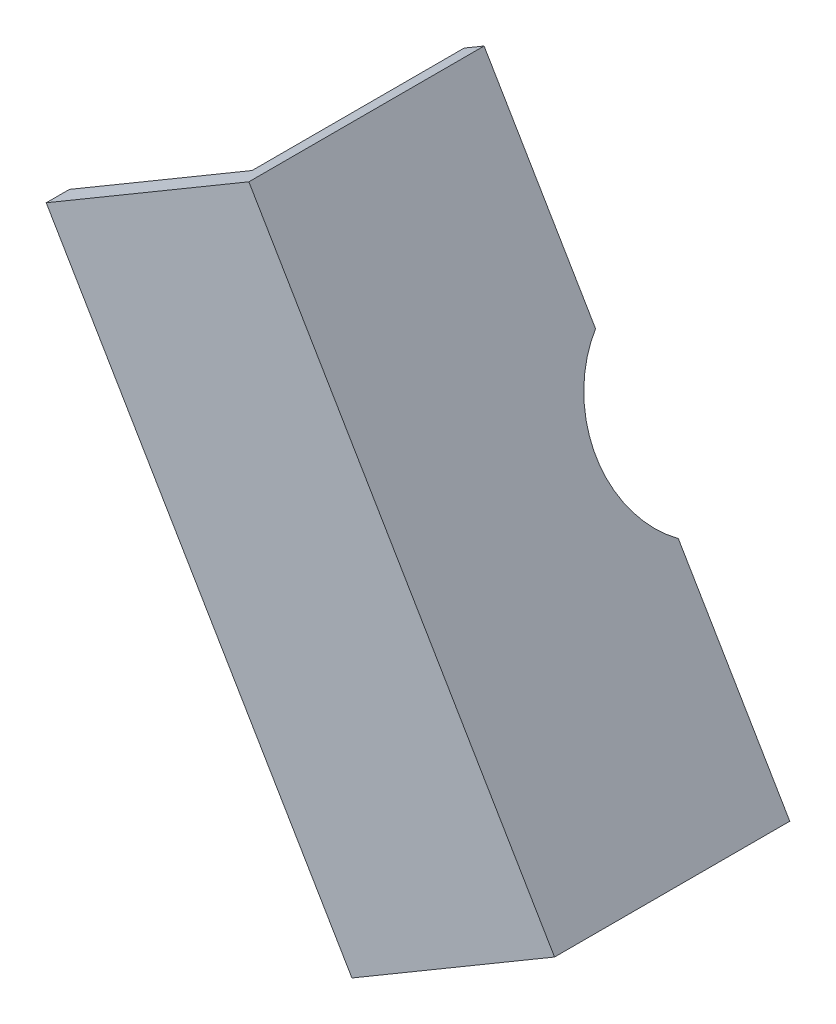
ISO-10303-21;
HEADER;
FILE_DESCRIPTION(('STEP AP214'),'2;1');
FILE_NAME('part.step','',(''),(''),'','','');
FILE_SCHEMA(('AUTOMOTIVE_DESIGN { 1 0 10303 214 1 1 1 1 }'));
ENDSEC;
DATA;
#1=APPLICATION_CONTEXT('core data for automotive mechanical design processes');
#2=APPLICATION_PROTOCOL_DEFINITION('international standard','automotive_design',2000,#1);
#3=PRODUCT_CONTEXT('',#1,'mechanical');
#4=PRODUCT('Part','Part','',(#3));
#5=PRODUCT_RELATED_PRODUCT_CATEGORY('part','',(#4));
#6=PRODUCT_DEFINITION_FORMATION('','',#4);
#7=PRODUCT_DEFINITION_CONTEXT('part definition',#1,'design');
#8=PRODUCT_DEFINITION('design','',#6,#7);
#9=PRODUCT_DEFINITION_SHAPE('','',#8);
#10=(LENGTH_UNIT() NAMED_UNIT(*) SI_UNIT(.MILLI.,.METRE.));
#11=(NAMED_UNIT(*) PLANE_ANGLE_UNIT() SI_UNIT($,.RADIAN.));
#12=(NAMED_UNIT(*) SI_UNIT($,.STERADIAN.) SOLID_ANGLE_UNIT());
#13=UNCERTAINTY_MEASURE_WITH_UNIT(LENGTH_MEASURE(1.E-05),#10,'distance_accuracy_value','');
#14=(GEOMETRIC_REPRESENTATION_CONTEXT(3) GLOBAL_UNCERTAINTY_ASSIGNED_CONTEXT((#13)) GLOBAL_UNIT_ASSIGNED_CONTEXT((#10,
#11,#12)) REPRESENTATION_CONTEXT('',''));
#15=CARTESIAN_POINT('',(0.,0.,0.));
#16=DIRECTION('',(0.,0.,1.));
#17=DIRECTION('',(1.,0.,0.));
#18=AXIS2_PLACEMENT_3D('',#15,#16,#17);
#19=CARTESIAN_POINT('',(79.57817681264,376.606483004832,19.2999999995877));
#20=DIRECTION('',(0.5078652266185,-0.861436539503485,1.64824969705134E-11));
#21=DIRECTION('',(1.87150619308623E-11,-8.10015303720301E-12,-1.));
#22=AXIS2_PLACEMENT_3D('',#19,#20,#21);
#23=PLANE('',#22);
#24=DIRECTION('',(-1.87155908713808E-11,8.09985199535993E-12,1.));
#25=VECTOR('',#24,1.);
#26=CARTESIAN_POINT('',(90.5184208640968,383.056371382989,31.9999999997402));
#27=LINE('',#26,#25);
#28=CARTESIAN_POINT('',(90.5184208645721,383.056371382783,6.59999999974017));
#29=VERTEX_POINT('',#28);
#30=CARTESIAN_POINT('',(90.5184208640968,383.056371382989,31.9999999997402));
#31=VERTEX_POINT('',#30);
#32=EDGE_CURVE('E131',#29,#31,#27,.T.);
#33=ORIENTED_EDGE('',*,*,#32,.T.);
#34=DIRECTION('',(-0.861436539503486,-0.5078652266185,-1.20084858275339E-11));
#35=VECTOR('',#34,1.);
#36=CARTESIAN_POINT('',(90.5184208640968,383.056371382989,31.9999999997402));
#37=LINE('',#36,#35);
#38=CARTESIAN_POINT('',(68.6379327607081,370.156594626879,31.9999999994352));
#39=VERTEX_POINT('',#38);
#40=EDGE_CURVE('E11',#31,#39,#37,.T.);
#41=ORIENTED_EDGE('',*,*,#40,.T.);
#42=DIRECTION('',(1.87155306265505E-11,-8.0998875130713E-12,-1.));
#43=VECTOR('',#42,1.);
#44=CARTESIAN_POINT('',(68.6379327607081,370.156594626879,31.9999999994352));
#45=LINE('',#44,#43);
#46=CARTESIAN_POINT('',(68.6379327607549,370.156594626859,29.4999999994352));
#47=VERTEX_POINT('',#46);
#48=EDGE_CURVE('E51',#39,#47,#45,.T.);
#49=ORIENTED_EDGE('',*,*,#48,.T.);
#50=DIRECTION('',(0.861436539503486,0.5078652266185,1.2008571337955E-11));
#51=VECTOR('',#50,1.);
#52=CARTESIAN_POINT('',(68.6379327607549,370.156594626859,29.4999999994352));
#53=LINE('',#52,#51);
#54=CARTESIAN_POINT('',(88.3648295153845,381.786708316423,29.4999999997102));
#55=VERTEX_POINT('',#54);
#56=EDGE_CURVE('E164',#47,#55,#53,.T.);
#57=ORIENTED_EDGE('',*,*,#56,.T.);
#58=DIRECTION('',(1.87155139211063E-11,-8.099897361869E-12,-1.));
#59=VECTOR('',#58,1.);
#60=CARTESIAN_POINT('',(88.3648295158134,381.786708316237,6.59999999971015));
#61=LINE('',#60,#59);
#62=CARTESIAN_POINT('',(88.3648295158134,381.786708316237,6.59999999971015));
#63=VERTEX_POINT('',#62);
#64=EDGE_CURVE('E212',#55,#63,#61,.T.);
#65=ORIENTED_EDGE('',*,*,#64,.T.);
#66=DIRECTION('',(0.861436539503486,0.5078652266185,1.20085907304969E-11));
#67=VECTOR('',#66,1.);
#68=CARTESIAN_POINT('',(90.5184208645721,383.056371382783,6.59999999974017));
#69=LINE('',#68,#67);
#70=EDGE_CURVE('E92',#63,#29,#69,.T.);
#71=ORIENTED_EDGE('',*,*,#70,.T.);
#72=EDGE_LOOP('',(#33,#41,#49,#57,#65,#71));
#73=FACE_BOUND('',#72,.T.);
#74=ADVANCED_FACE('F47',(#73),#23,.T.);
#75=CARTESIAN_POINT('',(46.5669370824375,432.599858072558,19.2999999985163));
#76=DIRECTION('',(-0.5078652266185,0.861436539503485,-1.64825062725662E-11));
#77=DIRECTION('',(-1.87193561732202E-11,8.09763213842995E-12,1.));
#78=AXIS2_PLACEMENT_3D('',#75,#76,#77);
#79=PLANE('',#78);
#80=DIRECTION('',(1.87155908713808E-11,-8.09985199535993E-12,-1.));
#81=VECTOR('',#80,1.);
#82=CARTESIAN_POINT('',(57.507181133894,439.049746450716,31.9999999986688));
#83=LINE('',#82,#81);
#84=CARTESIAN_POINT('',(57.507181133894,439.049746450716,31.9999999986688));
#85=VERTEX_POINT('',#84);
#86=CARTESIAN_POINT('',(57.5071811343697,439.049746450509,6.5999999986688));
#87=VERTEX_POINT('',#86);
#88=EDGE_CURVE('E197',#85,#87,#83,.T.);
#89=ORIENTED_EDGE('',*,*,#88,.T.);
#90=DIRECTION('',(-0.861436539503486,-0.5078652266185,-1.20085907304969E-11));
#91=VECTOR('',#90,1.);
#92=CARTESIAN_POINT('',(57.5071811343697,439.049746450509,6.5999999986688));
#93=LINE('',#92,#91);
#94=CARTESIAN_POINT('',(55.3535897856107,437.780083383964,6.59999999863879));
#95=VERTEX_POINT('',#94);
#96=EDGE_CURVE('E140',#87,#95,#93,.T.);
#97=ORIENTED_EDGE('',*,*,#96,.T.);
#98=DIRECTION('',(-1.87155139211063E-11,8.099897361869E-12,1.));
#99=VECTOR('',#98,1.);
#100=CARTESIAN_POINT('',(55.3535897856107,437.780083383964,6.59999999863879));
#101=LINE('',#100,#99);
#102=CARTESIAN_POINT('',(55.3535897851821,437.780083384149,29.4999999986387));
#103=VERTEX_POINT('',#102);
#104=EDGE_CURVE('E168',#95,#103,#101,.T.);
#105=ORIENTED_EDGE('',*,*,#104,.T.);
#106=DIRECTION('',(0.861436539503486,0.5078652266185,1.2008571337955E-11));
#107=VECTOR('',#106,1.);
#108=CARTESIAN_POINT('',(35.6266930305525,426.149969694585,29.4999999983638));
#109=LINE('',#108,#107);
#110=CARTESIAN_POINT('',(35.6266930305525,426.149969694585,29.4999999983638));
#111=VERTEX_POINT('',#110);
#112=EDGE_CURVE('E162',#111,#103,#109,.T.);
#113=ORIENTED_EDGE('',*,*,#112,.F.);
#114=DIRECTION('',(1.87155306265505E-11,-8.0998875130713E-12,-1.));
#115=VECTOR('',#114,1.);
#116=CARTESIAN_POINT('',(35.6266930305057,426.149969694606,31.9999999983638));
#117=LINE('',#116,#115);
#118=CARTESIAN_POINT('',(35.6266930305057,426.149969694606,31.9999999983638));
#119=VERTEX_POINT('',#118);
#120=EDGE_CURVE('E148',#119,#111,#117,.T.);
#121=ORIENTED_EDGE('',*,*,#120,.F.);
#122=DIRECTION('',(-0.861436539503486,-0.5078652266185,-1.20084858275339E-11));
#123=VECTOR('',#122,1.);
#124=CARTESIAN_POINT('',(57.507181133894,439.049746450716,31.9999999986688));
#125=LINE('',#124,#123);
#126=EDGE_CURVE('E58',#85,#119,#125,.T.);
#127=ORIENTED_EDGE('',*,*,#126,.F.);
#128=EDGE_LOOP('',(#89,#97,#105,#113,#121,#127));
#129=FACE_BOUND('',#128,.T.);
#130=ADVANCED_FACE('F166',(#129),#79,.T.);
#131=CARTESIAN_POINT('',(57.507181133894,439.049746450716,31.9999999986688));
#132=DIRECTION('',(-1.8715435535116E-11,8.09993277651021E-12,1.));
#133=DIRECTION('',(0.368573100225641,-0.9295987681737,1.44276936285845E-11));
#134=AXIS2_PLACEMENT_3D('',#131,#132,#133);
#135=PLANE('',#134);
#136=ORIENTED_EDGE('',*,*,#126,.T.);
#137=DIRECTION('',(0.5078652266185,-0.861436539503486,1.64824969705134E-11));
#138=VECTOR('',#137,1.);
#139=CARTESIAN_POINT('',(35.6266930305057,426.149969694606,31.9999999983638));
#140=LINE('',#139,#138);
#141=EDGE_CURVE('E154',#119,#39,#140,.T.);
#142=ORIENTED_EDGE('',*,*,#141,.T.);
#143=ORIENTED_EDGE('',*,*,#40,.F.);
#144=DIRECTION('',(0.5078652266185,-0.861436539503486,1.64824969705134E-11));
#145=VECTOR('',#144,1.);
#146=CARTESIAN_POINT('',(57.507181133894,439.049746450716,31.9999999986688));
#147=LINE('',#146,#145);
#148=EDGE_CURVE('E193',#85,#31,#147,.T.);
#149=ORIENTED_EDGE('',*,*,#148,.F.);
#150=EDGE_LOOP('',(#136,#142,#143,#149));
#151=FACE_BOUND('',#150,.T.);
#152=ADVANCED_FACE('F49',(#151),#135,.T.);
#153=CARTESIAN_POINT('',(35.6266930305057,426.149969694606,31.9999999983638));
#154=DIRECTION('',(-0.861436539503485,-0.5078652266185,-1.20085907304969E-11));
#155=DIRECTION('',(-0.5078652266185,0.861436539503485,-1.64817454349275E-11));
#156=AXIS2_PLACEMENT_3D('',#153,#154,#155);
#157=PLANE('',#156);
#158=ORIENTED_EDGE('',*,*,#120,.T.);
#159=DIRECTION('',(0.5078652266185,-0.861436539503486,1.64824969705134E-11));
#160=VECTOR('',#159,1.);
#161=CARTESIAN_POINT('',(35.6266930305525,426.149969694585,29.4999999983638));
#162=LINE('',#161,#160);
#163=EDGE_CURVE('E152',#111,#47,#162,.T.);
#164=ORIENTED_EDGE('',*,*,#163,.T.);
#165=ORIENTED_EDGE('',*,*,#48,.F.);
#166=ORIENTED_EDGE('',*,*,#141,.F.);
#167=EDGE_LOOP('',(#158,#164,#165,#166));
#168=FACE_BOUND('',#167,.T.);
#169=ADVANCED_FACE('F150',(#168),#157,.T.);
#170=CARTESIAN_POINT('',(35.6266930305525,426.149969694585,29.4999999983638));
#171=DIRECTION('',(1.87155091969172E-11,-8.09988934874085E-12,-1.));
#172=DIRECTION('',(0.368573100225641,-0.9295987681737,1.4427680407942E-11));
#173=AXIS2_PLACEMENT_3D('',#170,#171,#172);
#174=PLANE('',#173);
#175=ORIENTED_EDGE('',*,*,#112,.T.);
#176=DIRECTION('',(0.5078652266185,-0.861436539503486,1.64824969705134E-11));
#177=VECTOR('',#176,1.);
#178=CARTESIAN_POINT('',(55.3535897851821,437.780083384149,29.4999999986387));
#179=LINE('',#178,#177);
#180=EDGE_CURVE('E214',#103,#55,#179,.T.);
#181=ORIENTED_EDGE('',*,*,#180,.T.);
#182=ORIENTED_EDGE('',*,*,#56,.F.);
#183=ORIENTED_EDGE('',*,*,#163,.F.);
#184=EDGE_LOOP('',(#175,#181,#182,#183));
#185=FACE_BOUND('',#184,.T.);
#186=ADVANCED_FACE('F160',(#185),#174,.T.);
#187=CARTESIAN_POINT('',(55.3535897856107,437.780083383964,6.59999999863879));
#188=DIRECTION('',(1.87155259023614E-11,-8.09987949994316E-12,-1.));
#189=DIRECTION('',(0.368573100225641,-0.9295987681737,1.44276774096892E-11));
#190=AXIS2_PLACEMENT_3D('',#187,#188,#189);
#191=PLANE('',#190);
#192=DIRECTION('',(-0.861436538228772,-0.507865228780658,-1.20086137842438E-11));
#193=VECTOR('',#192,1.);
#194=CARTESIAN_POINT('',(67.3899947126,417.364036831354,6.59999999902942));
#195=LINE('',#194,#193);
#196=CARTESIAN_POINT('',(69.5435860581719,418.633699903305,6.59999999905944));
#197=VERTEX_POINT('',#196);
#198=CARTESIAN_POINT('',(67.3899947125999,417.364036831354,6.59999999902942));
#199=VERTEX_POINT('',#198);
#200=EDGE_CURVE('E187',#197,#199,#195,.T.);
#201=ORIENTED_EDGE('',*,*,#200,.T.);
#202=DIRECTION('',(0.5078652266185,-0.861436539503486,1.64824969705134E-11));
#203=VECTOR('',#202,1.);
#204=CARTESIAN_POINT('',(55.3535897856107,437.780083383964,6.59999999863879));
#205=LINE('',#204,#203);
#206=EDGE_CURVE('E182',#95,#199,#205,.T.);
#207=ORIENTED_EDGE('',*,*,#206,.F.);
#208=ORIENTED_EDGE('',*,*,#96,.F.);
#209=DIRECTION('',(0.5078652266185,-0.861436539503486,1.64824969705134E-11));
#210=VECTOR('',#209,1.);
#211=CARTESIAN_POINT('',(57.5071811343697,439.049746450509,6.5999999986688));
#212=LINE('',#211,#210);
#213=EDGE_CURVE('E204',#87,#197,#212,.T.);
#214=ORIENTED_EDGE('',*,*,#213,.T.);
#215=EDGE_LOOP('',(#201,#207,#208,#214));
#216=FACE_BOUND('',#215,.T.);
#217=ADVANCED_FACE('F233',(#216),#191,.T.);
#218=CARTESIAN_POINT('',(57.5071811343693,439.04974645051,6.5999999986688));
#219=DIRECTION('',(0.861436539503485,0.5078652266185,1.20086606658055E-11));
#220=DIRECTION('',(1.87136112316479E-11,-8.09649414782166E-12,-1.));
#221=AXIS2_PLACEMENT_3D('',#218,#219,#220);
#222=PLANE('',#221);
#223=CARTESIAN_POINT('',(74.0128010007451,411.053058914641,-7.9448879807312E-10));
#224=DIRECTION('',(-0.861436539503485,-0.5078652266185,-1.20086606658055E-11));
#225=DIRECTION('',(0.5078652266185,-0.861436539503485,1.64818082816426E-11));
#226=AXIS2_PLACEMENT_3D('',#223,#224,#225);
#227=CIRCLE('',#226,11.);
#228=CARTESIAN_POINT('',(78.4820140847126,403.472416830478,6.59999999934953));
#229=VERTEX_POINT('',#228);
#230=EDGE_CURVE('E179',#229,#197,#227,.T.);
#231=ORIENTED_EDGE('',*,*,#230,.T.);
#232=ORIENTED_EDGE('',*,*,#213,.F.);
#233=ORIENTED_EDGE('',*,*,#88,.F.);
#234=ORIENTED_EDGE('',*,*,#148,.T.);
#235=ORIENTED_EDGE('',*,*,#32,.F.);
#236=DIRECTION('',(0.5078652266185,-0.861436539503486,1.64824969705134E-11));
#237=VECTOR('',#236,1.);
#238=CARTESIAN_POINT('',(57.5071811343697,439.049746450509,6.5999999986688));
#239=LINE('',#238,#237);
#240=EDGE_CURVE('E104',#229,#29,#239,.T.);
#241=ORIENTED_EDGE('',*,*,#240,.F.);
#242=EDGE_LOOP('',(#231,#232,#233,#234,#235,#241));
#243=FACE_BOUND('',#242,.T.);
#244=ADVANCED_FACE('F228',(#243),#222,.T.);
#245=CARTESIAN_POINT('',(55.3535897856107,437.780083383964,6.59999999863879));
#246=DIRECTION('',(1.87155259023614E-11,-8.09987949994316E-12,-1.));
#247=DIRECTION('',(0.368573100225641,-0.9295987681737,1.44276774096892E-11));
#248=AXIS2_PLACEMENT_3D('',#245,#246,#247);
#249=PLANE('',#248);
#250=DIRECTION('',(0.861436538228772,0.507865228780658,1.20086137842438E-11));
#251=VECTOR('',#250,1.);
#252=CARTESIAN_POINT('',(76.3284227391403,402.202753758526,6.59999999931951));
#253=LINE('',#252,#251);
#254=CARTESIAN_POINT('',(76.3284227391404,402.202753758526,6.59999999931951));
#255=VERTEX_POINT('',#254);
#256=EDGE_CURVE('E215',#255,#229,#253,.T.);
#257=ORIENTED_EDGE('',*,*,#256,.T.);
#258=ORIENTED_EDGE('',*,*,#240,.T.);
#259=ORIENTED_EDGE('',*,*,#70,.F.);
#260=DIRECTION('',(0.5078652266185,-0.861436539503486,1.64824969705134E-11));
#261=VECTOR('',#260,1.);
#262=CARTESIAN_POINT('',(55.3535897856107,437.780083383964,6.59999999863879));
#263=LINE('',#262,#261);
#264=EDGE_CURVE('E208',#255,#63,#263,.T.);
#265=ORIENTED_EDGE('',*,*,#264,.F.);
#266=EDGE_LOOP('',(#257,#258,#259,#265));
#267=FACE_BOUND('',#266,.T.);
#268=ADVANCED_FACE('F317',(#267),#249,.T.);
#269=CARTESIAN_POINT('',(55.3535897851821,437.780083384149,29.4999999986387));
#270=DIRECTION('',(-0.861436539503485,-0.5078652266185,-1.20085713379549E-11));
#271=DIRECTION('',(-0.5078652266185,0.861436539503485,-1.64817454349275E-11));
#272=AXIS2_PLACEMENT_3D('',#269,#270,#271);
#273=PLANE('',#272);
#274=CARTESIAN_POINT('',(71.859209655173,409.78339584269,-8.24510332533735E-10));
#275=DIRECTION('',(0.861436539503485,0.5078652266185,1.20085713379549E-11));
#276=DIRECTION('',(0.5078652266185,-0.861436539503485,1.64818082816426E-11));
#277=AXIS2_PLACEMENT_3D('',#274,#275,#276);
#278=CIRCLE('',#277,11.);
#279=EDGE_CURVE('E191',#199,#255,#278,.T.);
#280=ORIENTED_EDGE('',*,*,#279,.T.);
#281=ORIENTED_EDGE('',*,*,#264,.T.);
#282=ORIENTED_EDGE('',*,*,#64,.F.);
#283=ORIENTED_EDGE('',*,*,#180,.F.);
#284=ORIENTED_EDGE('',*,*,#104,.F.);
#285=ORIENTED_EDGE('',*,*,#206,.T.);
#286=EDGE_LOOP('',(#280,#281,#282,#283,#284,#285));
#287=FACE_BOUND('',#286,.T.);
#288=ADVANCED_FACE('F312',(#287),#273,.T.);
#289=CARTESIAN_POINT('',(71.8592087259939,409.783395294886,-8.24510345486694E-10));
#290=DIRECTION('',(0.861436538228772,0.507865228780658,1.20086137842438E-11));
#291=DIRECTION('',(-1.87151960362082E-11,8.0992745089795E-12,1.));
#292=AXIS2_PLACEMENT_3D('',#289,#290,#291);
#293=CYLINDRICAL_SURFACE('',#292,11.);
#294=ORIENTED_EDGE('',*,*,#279,.F.);
#295=ORIENTED_EDGE('',*,*,#200,.F.);
#296=ORIENTED_EDGE('',*,*,#230,.F.);
#297=ORIENTED_EDGE('',*,*,#256,.F.);
#298=EDGE_LOOP('',(#294,#295,#296,#297));
#299=FACE_BOUND('',#298,.T.);
#300=ADVANCED_FACE('F231',(#299),#293,.F.);
#301=CLOSED_SHELL('',(#74,#130,#152,#169,#186,#217,#244,#268,#288,#300));
#302=MANIFOLD_SOLID_BREP('B2',#301);
#303=ADVANCED_BREP_SHAPE_REPRESENTATION('',(#18,#302),#14);
#304=SHAPE_DEFINITION_REPRESENTATION(#9,#303);
ENDSEC;
END-ISO-10303-21;
